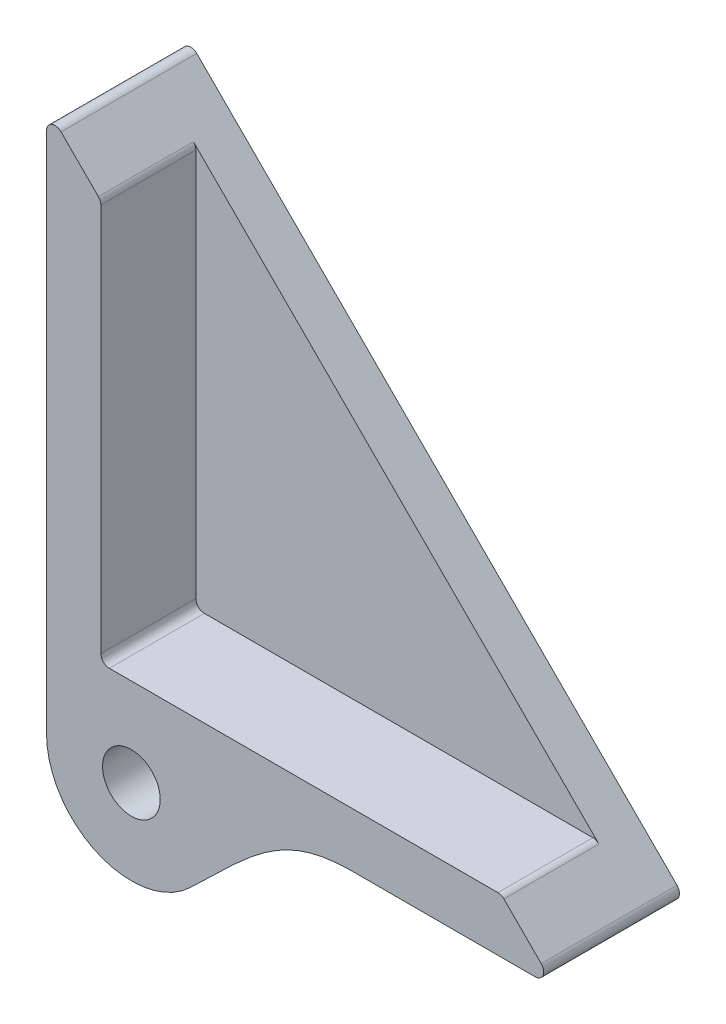
ISO-10303-21;
HEADER;
FILE_DESCRIPTION(('STEP AP214'),'2;1');
FILE_NAME('part.step','',(''),(''),'','','');
FILE_SCHEMA(('AUTOMOTIVE_DESIGN { 1 0 10303 214 1 1 1 1 }'));
ENDSEC;
DATA;
#1=APPLICATION_CONTEXT('core data for automotive mechanical design processes');
#2=APPLICATION_PROTOCOL_DEFINITION('international standard','automotive_design',2000,#1);
#3=PRODUCT_CONTEXT('',#1,'mechanical');
#4=PRODUCT('Part','Part','',(#3));
#5=PRODUCT_RELATED_PRODUCT_CATEGORY('part','',(#4));
#6=PRODUCT_DEFINITION_FORMATION('','',#4);
#7=PRODUCT_DEFINITION_CONTEXT('part definition',#1,'design');
#8=PRODUCT_DEFINITION('design','',#6,#7);
#9=PRODUCT_DEFINITION_SHAPE('','',#8);
#10=(LENGTH_UNIT() NAMED_UNIT(*) SI_UNIT(.MILLI.,.METRE.));
#11=(NAMED_UNIT(*) PLANE_ANGLE_UNIT() SI_UNIT($,.RADIAN.));
#12=(NAMED_UNIT(*) SI_UNIT($,.STERADIAN.) SOLID_ANGLE_UNIT());
#13=UNCERTAINTY_MEASURE_WITH_UNIT(LENGTH_MEASURE(1.E-05),#10,'distance_accuracy_value','');
#14=(GEOMETRIC_REPRESENTATION_CONTEXT(3) GLOBAL_UNCERTAINTY_ASSIGNED_CONTEXT((#13)) GLOBAL_UNIT_ASSIGNED_CONTEXT((#10,
#11,#12)) REPRESENTATION_CONTEXT('',''));
#15=CARTESIAN_POINT('',(0.,0.,0.));
#16=DIRECTION('',(0.,0.,1.));
#17=DIRECTION('',(1.,0.,0.));
#18=AXIS2_PLACEMENT_3D('',#15,#16,#17);
#19=CARTESIAN_POINT('',(5.,-2.,1.));
#20=DIRECTION('',(0.,0.,-1.));
#21=DIRECTION('',(-1.,0.,0.));
#22=AXIS2_PLACEMENT_3D('',#19,#20,#21);
#23=CYLINDRICAL_SURFACE('',#22,3.7);
#24=CARTESIAN_POINT('',(5.,-2.,0.));
#25=DIRECTION('',(0.,0.,-1.));
#26=DIRECTION('',(-1.,0.,0.));
#27=AXIS2_PLACEMENT_3D('',#24,#25,#26);
#28=CIRCLE('',#27,3.7);
#29=CARTESIAN_POINT('',(1.3,-2.,0.));
#30=VERTEX_POINT('',#29);
#31=EDGE_CURVE('E331',#30,#30,#28,.T.);
#32=ORIENTED_EDGE('',*,*,#31,.T.);
#33=EDGE_LOOP('',(#32));
#34=FACE_BOUND('',#33,.T.);
#35=CARTESIAN_POINT('',(5.,-2.,0.6));
#36=DIRECTION('',(0.,0.,1.));
#37=DIRECTION('',(1.,0.,0.));
#38=AXIS2_PLACEMENT_3D('',#35,#36,#37);
#39=CIRCLE('',#38,3.7);
#40=CARTESIAN_POINT('',(8.7,-2.,0.6));
#41=VERTEX_POINT('',#40);
#42=EDGE_CURVE('E11',#41,#41,#39,.F.);
#43=ORIENTED_EDGE('',*,*,#42,.F.);
#44=EDGE_LOOP('',(#43));
#45=FACE_BOUND('',#44,.T.);
#46=ADVANCED_FACE('F36',(#34,#45),#23,.F.);
#47=CARTESIAN_POINT('',(5.,-2.,8.));
#48=DIRECTION('',(0.,0.,-1.));
#49=DIRECTION('',(-1.,0.,0.));
#50=AXIS2_PLACEMENT_3D('',#47,#48,#49);
#51=CYLINDRICAL_SURFACE('',#50,1.7);
#52=CARTESIAN_POINT('',(5.,-2.,3.4));
#53=DIRECTION('',(0.,0.,1.));
#54=DIRECTION('',(1.,0.,0.));
#55=AXIS2_PLACEMENT_3D('',#52,#53,#54);
#56=CIRCLE('',#55,1.7);
#57=CARTESIAN_POINT('',(6.7,-2.,3.4));
#58=VERTEX_POINT('',#57);
#59=EDGE_CURVE('E46',#58,#58,#56,.T.);
#60=ORIENTED_EDGE('',*,*,#59,.F.);
#61=EDGE_LOOP('',(#60));
#62=FACE_BOUND('',#61,.T.);
#63=CARTESIAN_POINT('',(5.,-2.,8.));
#64=DIRECTION('',(0.,0.,1.));
#65=DIRECTION('',(1.,0.,0.));
#66=AXIS2_PLACEMENT_3D('',#63,#64,#65);
#67=CIRCLE('',#66,1.7);
#68=CARTESIAN_POINT('',(6.7,-2.,8.));
#69=VERTEX_POINT('',#68);
#70=EDGE_CURVE('E221',#69,#69,#67,.T.);
#71=ORIENTED_EDGE('',*,*,#70,.T.);
#72=EDGE_LOOP('',(#71));
#73=FACE_BOUND('',#72,.T.);
#74=ADVANCED_FACE('F215',(#62,#73),#51,.F.);
#75=CARTESIAN_POINT('',(5.,-2.,8.));
#76=DIRECTION('',(0.,0.,1.));
#77=DIRECTION('',(1.,0.,0.));
#78=AXIS2_PLACEMENT_3D('',#75,#76,#77);
#79=PLANE('',#78);
#80=DIRECTION('',(0.,-1.,0.));
#81=VECTOR('',#80,1.);
#82=CARTESIAN_POINT('',(3.2,26.8,8.));
#83=LINE('',#82,#81);
#84=CARTESIAN_POINT('',(3.2,26.5928932188135,8.));
#85=VERTEX_POINT('',#84);
#86=CARTESIAN_POINT('',(3.2,3.7,8.));
#87=VERTEX_POINT('',#86);
#88=EDGE_CURVE('E330',#85,#87,#83,.T.);
#89=ORIENTED_EDGE('',*,*,#88,.F.);
#90=CARTESIAN_POINT('',(2.7,26.5928932188135,8.));
#91=DIRECTION('',(0.,0.,1.));
#92=DIRECTION('',(1.,0.,0.));
#93=AXIS2_PLACEMENT_3D('',#90,#91,#92);
#94=CIRCLE('',#93,0.5);
#95=CARTESIAN_POINT('',(3.05355339059328,26.9464466094067,8.));
#96=VERTEX_POINT('',#95);
#97=EDGE_CURVE('E182',#85,#96,#94,.T.);
#98=ORIENTED_EDGE('',*,*,#97,.T.);
#99=DIRECTION('',(-0.707106781186548,0.707106781186547,0.));
#100=VECTOR('',#99,1.);
#101=CARTESIAN_POINT('',(0.,30.,8.));
#102=LINE('',#101,#100);
#103=CARTESIAN_POINT('',(0.853553390593273,29.1464466094067,8.));
#104=VERTEX_POINT('',#103);
#105=EDGE_CURVE('E315',#96,#104,#102,.T.);
#106=ORIENTED_EDGE('',*,*,#105,.T.);
#107=CARTESIAN_POINT('',(0.5,28.7928932188135,8.));
#108=DIRECTION('',(0.,0.,1.));
#109=DIRECTION('',(1.,0.,0.));
#110=AXIS2_PLACEMENT_3D('',#107,#108,#109);
#111=CIRCLE('',#110,0.5);
#112=CARTESIAN_POINT('',(0.,28.7928932188135,8.));
#113=VERTEX_POINT('',#112);
#114=EDGE_CURVE('E143',#104,#113,#111,.T.);
#115=ORIENTED_EDGE('',*,*,#114,.T.);
#116=DIRECTION('',(0.,-1.,0.));
#117=VECTOR('',#116,1.);
#118=CARTESIAN_POINT('',(0.,0.,8.));
#119=LINE('',#118,#117);
#120=CARTESIAN_POINT('',(0.,-2.,8.));
#121=VERTEX_POINT('',#120);
#122=EDGE_CURVE('E134',#113,#121,#119,.T.);
#123=ORIENTED_EDGE('',*,*,#122,.T.);
#124=CARTESIAN_POINT('',(5.,-2.,8.));
#125=DIRECTION('',(0.,0.,1.));
#126=DIRECTION('',(1.,0.,0.));
#127=AXIS2_PLACEMENT_3D('',#124,#125,#126);
#128=CIRCLE('',#127,5.);
#129=CARTESIAN_POINT('',(8.45751468859107,-5.61186823931563,8.));
#130=VERTEX_POINT('',#129);
#131=EDGE_CURVE('E139',#121,#130,#128,.T.);
#132=ORIENTED_EDGE('',*,*,#131,.T.);
#133=CARTESIAN_POINT('',(8.45751468859107,-5.61186823931563,8.));
#134=CARTESIAN_POINT('',(12.0907630120424,-2.13388714662437,8.));
#135=CARTESIAN_POINT('',(13.8512402383362,0.,8.));
#136=CARTESIAN_POINT('',(18.,0.,8.));
#137=B_SPLINE_CURVE_WITH_KNOTS('',3,(#133,#134,#135,#136),.UNSPECIFIED.,.F.,.F.,(4,4),(0.,1.),.UNSPECIFIED.);
#138=CARTESIAN_POINT('',(18.,0.,8.));
#139=VERTEX_POINT('',#138);
#140=EDGE_CURVE('E155',#130,#139,#137,.T.);
#141=ORIENTED_EDGE('',*,*,#140,.T.);
#142=DIRECTION('',(1.,0.,0.));
#143=VECTOR('',#142,1.);
#144=CARTESIAN_POINT('',(18.,0.,8.));
#145=LINE('',#144,#143);
#146=CARTESIAN_POINT('',(28.7928932188135,0.,8.));
#147=VERTEX_POINT('',#146);
#148=EDGE_CURVE('E238',#139,#147,#145,.T.);
#149=ORIENTED_EDGE('',*,*,#148,.T.);
#150=CARTESIAN_POINT('',(28.7928932188135,0.500000000000011,8.));
#151=DIRECTION('',(0.,0.,1.));
#152=DIRECTION('',(1.,0.,0.));
#153=AXIS2_PLACEMENT_3D('',#150,#151,#152);
#154=CIRCLE('',#153,0.5);
#155=CARTESIAN_POINT('',(29.1464466094067,0.853553390593276,8.));
#156=VERTEX_POINT('',#155);
#157=EDGE_CURVE('E178',#147,#156,#154,.T.);
#158=ORIENTED_EDGE('',*,*,#157,.T.);
#159=CARTESIAN_POINT('',(26.9464466094067,3.05355339059327,8.));
#160=VERTEX_POINT('',#159);
#161=EDGE_CURVE('E319',#156,#160,#102,.T.);
#162=ORIENTED_EDGE('',*,*,#161,.T.);
#163=CARTESIAN_POINT('',(26.5928932188135,2.7,8.));
#164=DIRECTION('',(0.,0.,1.));
#165=DIRECTION('',(1.,0.,0.));
#166=AXIS2_PLACEMENT_3D('',#163,#164,#165);
#167=CIRCLE('',#166,0.5);
#168=CARTESIAN_POINT('',(26.5928932188135,3.2,8.));
#169=VERTEX_POINT('',#168);
#170=EDGE_CURVE('E180',#160,#169,#167,.T.);
#171=ORIENTED_EDGE('',*,*,#170,.T.);
#172=DIRECTION('',(1.,0.,0.));
#173=VECTOR('',#172,1.);
#174=CARTESIAN_POINT('',(3.2,3.2,8.));
#175=LINE('',#174,#173);
#176=CARTESIAN_POINT('',(3.7,3.2,8.));
#177=VERTEX_POINT('',#176);
#178=EDGE_CURVE('E231',#177,#169,#175,.T.);
#179=ORIENTED_EDGE('',*,*,#178,.F.);
#180=CARTESIAN_POINT('',(3.7,3.7,8.));
#181=DIRECTION('',(0.,0.,1.));
#182=DIRECTION('',(1.,0.,0.));
#183=AXIS2_PLACEMENT_3D('',#180,#181,#182);
#184=CIRCLE('',#183,0.5);
#185=EDGE_CURVE('E201',#177,#87,#184,.F.);
#186=ORIENTED_EDGE('',*,*,#185,.T.);
#187=EDGE_LOOP('',(#89,#98,#106,#115,#123,#132,#141,#149,#158,#162,#171,#179,#186));
#188=FACE_BOUND('',#187,.T.);
#189=ORIENTED_EDGE('',*,*,#70,.F.);
#190=EDGE_LOOP('',(#189));
#191=FACE_BOUND('',#190,.T.);
#192=ADVANCED_FACE('F137',(#188,#191),#79,.T.);
#193=CARTESIAN_POINT('',(5.,-2.,0.));
#194=DIRECTION('',(0.,0.,1.));
#195=DIRECTION('',(1.,0.,0.));
#196=AXIS2_PLACEMENT_3D('',#193,#194,#195);
#197=PLANE('',#196);
#198=ORIENTED_EDGE('',*,*,#31,.F.);
#199=EDGE_LOOP('',(#198));
#200=FACE_BOUND('',#199,.T.);
#201=DIRECTION('',(-0.707106781186548,0.707106781186547,0.));
#202=VECTOR('',#201,1.);
#203=CARTESIAN_POINT('',(0.,30.,0.));
#204=LINE('',#203,#202);
#205=CARTESIAN_POINT('',(29.1464466094067,0.853553390593276,0.));
#206=VERTEX_POINT('',#205);
#207=CARTESIAN_POINT('',(0.853553390593273,29.1464466094067,0.));
#208=VERTEX_POINT('',#207);
#209=EDGE_CURVE('E479',#206,#208,#204,.T.);
#210=ORIENTED_EDGE('',*,*,#209,.F.);
#211=CARTESIAN_POINT('',(28.7928932188135,0.500000000000011,0.));
#212=DIRECTION('',(0.,0.,1.));
#213=DIRECTION('',(1.,0.,0.));
#214=AXIS2_PLACEMENT_3D('',#211,#212,#213);
#215=CIRCLE('',#214,0.5);
#216=CARTESIAN_POINT('',(28.7928932188135,0.,0.));
#217=VERTEX_POINT('',#216);
#218=EDGE_CURVE('E53',#206,#217,#215,.F.);
#219=ORIENTED_EDGE('',*,*,#218,.T.);
#220=DIRECTION('',(1.,0.,0.));
#221=VECTOR('',#220,1.);
#222=CARTESIAN_POINT('',(18.,0.,0.));
#223=LINE('',#222,#221);
#224=CARTESIAN_POINT('',(18.,0.,0.));
#225=VERTEX_POINT('',#224);
#226=EDGE_CURVE('E480',#225,#217,#223,.T.);
#227=ORIENTED_EDGE('',*,*,#226,.F.);
#228=CARTESIAN_POINT('',(8.45751468859107,-5.61186823931563,0.));
#229=CARTESIAN_POINT('',(12.0907630120424,-2.13388714662437,0.));
#230=CARTESIAN_POINT('',(13.8512402383362,0.,0.));
#231=CARTESIAN_POINT('',(18.,0.,0.));
#232=B_SPLINE_CURVE_WITH_KNOTS('',3,(#228,#229,#230,#231),.UNSPECIFIED.,.F.,.F.,(4,4),(0.,1.),.UNSPECIFIED.);
#233=CARTESIAN_POINT('',(8.45751468859107,-5.61186823931563,0.));
#234=VERTEX_POINT('',#233);
#235=EDGE_CURVE('E225',#234,#225,#232,.T.);
#236=ORIENTED_EDGE('',*,*,#235,.F.);
#237=CARTESIAN_POINT('',(5.,-2.,0.));
#238=DIRECTION('',(0.,0.,1.));
#239=DIRECTION('',(1.,0.,0.));
#240=AXIS2_PLACEMENT_3D('',#237,#238,#239);
#241=CIRCLE('',#240,5.);
#242=CARTESIAN_POINT('',(0.,-2.,0.));
#243=VERTEX_POINT('',#242);
#244=EDGE_CURVE('E222',#243,#234,#241,.T.);
#245=ORIENTED_EDGE('',*,*,#244,.F.);
#246=DIRECTION('',(0.,-1.,0.));
#247=VECTOR('',#246,1.);
#248=CARTESIAN_POINT('',(0.,0.,0.));
#249=LINE('',#248,#247);
#250=CARTESIAN_POINT('',(0.,28.7928932188135,0.));
#251=VERTEX_POINT('',#250);
#252=EDGE_CURVE('E146',#251,#243,#249,.T.);
#253=ORIENTED_EDGE('',*,*,#252,.F.);
#254=CARTESIAN_POINT('',(0.5,28.7928932188135,0.));
#255=DIRECTION('',(0.,0.,1.));
#256=DIRECTION('',(1.,0.,0.));
#257=AXIS2_PLACEMENT_3D('',#254,#255,#256);
#258=CIRCLE('',#257,0.5);
#259=EDGE_CURVE('E61',#251,#208,#258,.F.);
#260=ORIENTED_EDGE('',*,*,#259,.T.);
#261=EDGE_LOOP('',(#210,#219,#227,#236,#245,#253,#260));
#262=FACE_BOUND('',#261,.T.);
#263=ADVANCED_FACE('F253',(#200,#262),#197,.F.);
#264=CARTESIAN_POINT('',(5.,-2.,8.));
#265=DIRECTION('',(0.,0.,-1.));
#266=DIRECTION('',(-1.,0.,0.));
#267=AXIS2_PLACEMENT_3D('',#264,#265,#266);
#268=CYLINDRICAL_SURFACE('',#267,5.);
#269=ORIENTED_EDGE('',*,*,#244,.T.);
#270=DIRECTION('',(0.,0.,-1.));
#271=VECTOR('',#270,1.);
#272=CARTESIAN_POINT('',(8.45751468859107,-5.61186823931563,8.));
#273=LINE('',#272,#271);
#274=EDGE_CURVE('E153',#130,#234,#273,.T.);
#275=ORIENTED_EDGE('',*,*,#274,.F.);
#276=ORIENTED_EDGE('',*,*,#131,.F.);
#277=DIRECTION('',(0.,0.,-1.));
#278=VECTOR('',#277,1.);
#279=CARTESIAN_POINT('',(0.,-2.,8.));
#280=LINE('',#279,#278);
#281=EDGE_CURVE('E151',#121,#243,#280,.T.);
#282=ORIENTED_EDGE('',*,*,#281,.T.);
#283=EDGE_LOOP('',(#269,#275,#276,#282));
#284=FACE_BOUND('',#283,.T.);
#285=ADVANCED_FACE('F150',(#284),#268,.T.);
#286=DIRECTION('',(0.,0.,-1.));
#287=VECTOR('',#286,1.);
#288=SURFACE_OF_LINEAR_EXTRUSION('',#137,#287);
#289=ORIENTED_EDGE('',*,*,#235,.T.);
#290=DIRECTION('',(0.,0.,-1.));
#291=VECTOR('',#290,1.);
#292=CARTESIAN_POINT('',(18.,0.,8.));
#293=LINE('',#292,#291);
#294=EDGE_CURVE('E164',#139,#225,#293,.T.);
#295=ORIENTED_EDGE('',*,*,#294,.F.);
#296=ORIENTED_EDGE('',*,*,#140,.F.);
#297=ORIENTED_EDGE('',*,*,#274,.T.);
#298=EDGE_LOOP('',(#289,#295,#296,#297));
#299=FACE_BOUND('',#298,.T.);
#300=ADVANCED_FACE('F244',(#299),#288,.F.);
#301=CARTESIAN_POINT('',(18.,0.,8.));
#302=DIRECTION('',(0.,1.,0.));
#303=DIRECTION('',(-1.,0.,0.));
#304=AXIS2_PLACEMENT_3D('',#301,#302,#303);
#305=PLANE('',#304);
#306=ORIENTED_EDGE('',*,*,#226,.T.);
#307=DIRECTION('',(0.,0.,-1.));
#308=VECTOR('',#307,1.);
#309=CARTESIAN_POINT('',(28.7928932188135,0.,8.));
#310=LINE('',#309,#308);
#311=EDGE_CURVE('E197',#217,#147,#310,.F.);
#312=ORIENTED_EDGE('',*,*,#311,.T.);
#313=ORIENTED_EDGE('',*,*,#148,.F.);
#314=ORIENTED_EDGE('',*,*,#294,.T.);
#315=EDGE_LOOP('',(#306,#312,#313,#314));
#316=FACE_BOUND('',#315,.T.);
#317=ADVANCED_FACE('F248',(#316),#305,.F.);
#318=CARTESIAN_POINT('',(0.,30.,8.));
#319=DIRECTION('',(-0.707106781186547,-0.707106781186548,0.));
#320=DIRECTION('',(0.707106781186548,-0.707106781186547,0.));
#321=AXIS2_PLACEMENT_3D('',#318,#319,#320);
#322=PLANE('',#321);
#323=ORIENTED_EDGE('',*,*,#105,.F.);
#324=DIRECTION('',(0.,0.,1.));
#325=VECTOR('',#324,1.);
#326=CARTESIAN_POINT('',(3.05355339059328,26.9464466094067,8.));
#327=LINE('',#326,#325);
#328=CARTESIAN_POINT('',(3.05355339059328,26.9464466094067,2.4));
#329=VERTEX_POINT('',#328);
#330=EDGE_CURVE('E192',#96,#329,#327,.F.);
#331=ORIENTED_EDGE('',*,*,#330,.T.);
#332=DIRECTION('',(-0.707106781186547,0.707106781186547,0.));
#333=VECTOR('',#332,1.);
#334=CARTESIAN_POINT('',(26.8,3.2,2.4));
#335=LINE('',#334,#333);
#336=CARTESIAN_POINT('',(26.9464466094067,3.05355339059328,2.4));
#337=VERTEX_POINT('',#336);
#338=EDGE_CURVE('E324',#337,#329,#335,.T.);
#339=ORIENTED_EDGE('',*,*,#338,.F.);
#340=DIRECTION('',(0.,0.,1.));
#341=VECTOR('',#340,1.);
#342=CARTESIAN_POINT('',(26.9464466094067,3.05355339059327,8.));
#343=LINE('',#342,#341);
#344=EDGE_CURVE('E189',#337,#160,#343,.T.);
#345=ORIENTED_EDGE('',*,*,#344,.T.);
#346=ORIENTED_EDGE('',*,*,#161,.F.);
#347=DIRECTION('',(0.,0.,-1.));
#348=VECTOR('',#347,1.);
#349=CARTESIAN_POINT('',(29.1464466094067,0.853553390593276,8.));
#350=LINE('',#349,#348);
#351=EDGE_CURVE('E186',#156,#206,#350,.T.);
#352=ORIENTED_EDGE('',*,*,#351,.T.);
#353=ORIENTED_EDGE('',*,*,#209,.T.);
#354=DIRECTION('',(0.,0.,-1.));
#355=VECTOR('',#354,1.);
#356=CARTESIAN_POINT('',(0.853553390593273,29.1464466094067,8.));
#357=LINE('',#356,#355);
#358=EDGE_CURVE('E184',#208,#104,#357,.F.);
#359=ORIENTED_EDGE('',*,*,#358,.T.);
#360=EDGE_LOOP('',(#323,#331,#339,#345,#346,#352,#353,#359));
#361=FACE_BOUND('',#360,.T.);
#362=ADVANCED_FACE('F307',(#361),#322,.F.);
#363=CARTESIAN_POINT('',(0.,0.,8.));
#364=DIRECTION('',(1.,0.,0.));
#365=DIRECTION('',(0.,0.,-1.));
#366=AXIS2_PLACEMENT_3D('',#363,#364,#365);
#367=PLANE('',#366);
#368=ORIENTED_EDGE('',*,*,#122,.F.);
#369=DIRECTION('',(0.,0.,-1.));
#370=VECTOR('',#369,1.);
#371=CARTESIAN_POINT('',(0.,28.7928932188135,8.));
#372=LINE('',#371,#370);
#373=EDGE_CURVE('E199',#113,#251,#372,.T.);
#374=ORIENTED_EDGE('',*,*,#373,.T.);
#375=ORIENTED_EDGE('',*,*,#252,.T.);
#376=ORIENTED_EDGE('',*,*,#281,.F.);
#377=EDGE_LOOP('',(#368,#374,#375,#376));
#378=FACE_BOUND('',#377,.T.);
#379=ADVANCED_FACE('F157',(#378),#367,.F.);
#380=CARTESIAN_POINT('',(3.2,3.2,2.4));
#381=DIRECTION('',(0.,-1.,0.));
#382=DIRECTION('',(1.,0.,0.));
#383=AXIS2_PLACEMENT_3D('',#380,#381,#382);
#384=PLANE('',#383);
#385=DIRECTION('',(1.,0.,0.));
#386=VECTOR('',#385,1.);
#387=CARTESIAN_POINT('',(3.2,3.2,2.4));
#388=LINE('',#387,#386);
#389=CARTESIAN_POINT('',(3.7,3.2,2.4));
#390=VERTEX_POINT('',#389);
#391=CARTESIAN_POINT('',(26.5928932188135,3.2,2.4));
#392=VERTEX_POINT('',#391);
#393=EDGE_CURVE('E223',#390,#392,#388,.T.);
#394=ORIENTED_EDGE('',*,*,#393,.F.);
#395=DIRECTION('',(0.,0.,1.));
#396=VECTOR('',#395,1.);
#397=CARTESIAN_POINT('',(3.7,3.2,8.));
#398=LINE('',#397,#396);
#399=EDGE_CURVE('E162',#390,#177,#398,.T.);
#400=ORIENTED_EDGE('',*,*,#399,.T.);
#401=ORIENTED_EDGE('',*,*,#178,.T.);
#402=DIRECTION('',(0.,0.,1.));
#403=VECTOR('',#402,1.);
#404=CARTESIAN_POINT('',(26.5928932188135,3.2,2.4));
#405=LINE('',#404,#403);
#406=EDGE_CURVE('E160',#169,#392,#405,.F.);
#407=ORIENTED_EDGE('',*,*,#406,.T.);
#408=EDGE_LOOP('',(#394,#400,#401,#407));
#409=FACE_BOUND('',#408,.T.);
#410=ADVANCED_FACE('F294',(#409),#384,.F.);
#411=CARTESIAN_POINT('',(3.2,26.8,2.4));
#412=DIRECTION('',(-1.,0.,0.));
#413=DIRECTION('',(0.,-1.,0.));
#414=AXIS2_PLACEMENT_3D('',#411,#412,#413);
#415=PLANE('',#414);
#416=ORIENTED_EDGE('',*,*,#88,.T.);
#417=DIRECTION('',(0.,0.,1.));
#418=VECTOR('',#417,1.);
#419=CARTESIAN_POINT('',(3.2,3.7,2.4));
#420=LINE('',#419,#418);
#421=CARTESIAN_POINT('',(3.2,3.7,2.4));
#422=VERTEX_POINT('',#421);
#423=EDGE_CURVE('E173',#87,#422,#420,.F.);
#424=ORIENTED_EDGE('',*,*,#423,.T.);
#425=DIRECTION('',(0.,-1.,0.));
#426=VECTOR('',#425,1.);
#427=CARTESIAN_POINT('',(3.2,26.8,2.4));
#428=LINE('',#427,#426);
#429=CARTESIAN_POINT('',(3.2,26.5928932188135,2.4));
#430=VERTEX_POINT('',#429);
#431=EDGE_CURVE('E228',#430,#422,#428,.T.);
#432=ORIENTED_EDGE('',*,*,#431,.F.);
#433=DIRECTION('',(0.,0.,1.));
#434=VECTOR('',#433,1.);
#435=CARTESIAN_POINT('',(3.2,26.5928932188135,2.4));
#436=LINE('',#435,#434);
#437=EDGE_CURVE('E170',#430,#85,#436,.T.);
#438=ORIENTED_EDGE('',*,*,#437,.T.);
#439=EDGE_LOOP('',(#416,#424,#432,#438));
#440=FACE_BOUND('',#439,.T.);
#441=ADVANCED_FACE('F292',(#440),#415,.F.);
#442=CARTESIAN_POINT('',(0.,0.,2.4));
#443=DIRECTION('',(0.,0.,1.));
#444=DIRECTION('',(1.,0.,0.));
#445=AXIS2_PLACEMENT_3D('',#442,#443,#444);
#446=PLANE('',#445);
#447=ORIENTED_EDGE('',*,*,#431,.T.);
#448=CARTESIAN_POINT('',(3.7,3.7,2.4));
#449=DIRECTION('',(0.,0.,1.));
#450=DIRECTION('',(1.,0.,0.));
#451=AXIS2_PLACEMENT_3D('',#448,#449,#450);
#452=CIRCLE('',#451,0.5);
#453=EDGE_CURVE('E175',#422,#390,#452,.T.);
#454=ORIENTED_EDGE('',*,*,#453,.T.);
#455=ORIENTED_EDGE('',*,*,#393,.T.);
#456=CARTESIAN_POINT('',(26.5928932188135,2.7,2.4));
#457=DIRECTION('',(0.,0.,1.));
#458=DIRECTION('',(1.,0.,0.));
#459=AXIS2_PLACEMENT_3D('',#456,#457,#458);
#460=CIRCLE('',#459,0.5);
#461=EDGE_CURVE('E205',#392,#337,#460,.F.);
#462=ORIENTED_EDGE('',*,*,#461,.T.);
#463=ORIENTED_EDGE('',*,*,#338,.T.);
#464=CARTESIAN_POINT('',(2.7,26.5928932188135,2.4));
#465=DIRECTION('',(0.,0.,1.));
#466=DIRECTION('',(1.,0.,0.));
#467=AXIS2_PLACEMENT_3D('',#464,#465,#466);
#468=CIRCLE('',#467,0.5);
#469=EDGE_CURVE('E203',#329,#430,#468,.F.);
#470=ORIENTED_EDGE('',*,*,#469,.T.);
#471=EDGE_LOOP('',(#447,#454,#455,#462,#463,#470));
#472=FACE_BOUND('',#471,.T.);
#473=ADVANCED_FACE('F258',(#472),#446,.T.);
#474=CARTESIAN_POINT('',(3.7,3.7,2.4));
#475=DIRECTION('',(0.,0.,-1.));
#476=DIRECTION('',(-1.,0.,0.));
#477=AXIS2_PLACEMENT_3D('',#474,#475,#476);
#478=CYLINDRICAL_SURFACE('',#477,0.5);
#479=ORIENTED_EDGE('',*,*,#453,.F.);
#480=ORIENTED_EDGE('',*,*,#423,.F.);
#481=ORIENTED_EDGE('',*,*,#185,.F.);
#482=ORIENTED_EDGE('',*,*,#399,.F.);
#483=EDGE_LOOP('',(#479,#480,#481,#482));
#484=FACE_BOUND('',#483,.T.);
#485=ADVANCED_FACE('F254',(#484),#478,.F.);
#486=CARTESIAN_POINT('',(2.7,26.5928932188135,2.4));
#487=DIRECTION('',(0.,0.,1.));
#488=DIRECTION('',(1.,0.,0.));
#489=AXIS2_PLACEMENT_3D('',#486,#487,#488);
#490=CYLINDRICAL_SURFACE('',#489,0.5);
#491=ORIENTED_EDGE('',*,*,#469,.F.);
#492=ORIENTED_EDGE('',*,*,#330,.F.);
#493=ORIENTED_EDGE('',*,*,#97,.F.);
#494=ORIENTED_EDGE('',*,*,#437,.F.);
#495=EDGE_LOOP('',(#491,#492,#493,#494));
#496=FACE_BOUND('',#495,.T.);
#497=ADVANCED_FACE('F257',(#496),#490,.T.);
#498=CARTESIAN_POINT('',(26.5928932188135,2.7,8.));
#499=DIRECTION('',(0.,0.,1.));
#500=DIRECTION('',(1.,0.,0.));
#501=AXIS2_PLACEMENT_3D('',#498,#499,#500);
#502=CYLINDRICAL_SURFACE('',#501,0.5);
#503=ORIENTED_EDGE('',*,*,#461,.F.);
#504=ORIENTED_EDGE('',*,*,#406,.F.);
#505=ORIENTED_EDGE('',*,*,#170,.F.);
#506=ORIENTED_EDGE('',*,*,#344,.F.);
#507=EDGE_LOOP('',(#503,#504,#505,#506));
#508=FACE_BOUND('',#507,.T.);
#509=ADVANCED_FACE('F262',(#508),#502,.T.);
#510=CARTESIAN_POINT('',(28.7928932188135,0.500000000000011,8.));
#511=DIRECTION('',(0.,0.,-1.));
#512=DIRECTION('',(-1.,0.,0.));
#513=AXIS2_PLACEMENT_3D('',#510,#511,#512);
#514=CYLINDRICAL_SURFACE('',#513,0.5);
#515=ORIENTED_EDGE('',*,*,#157,.F.);
#516=ORIENTED_EDGE('',*,*,#311,.F.);
#517=ORIENTED_EDGE('',*,*,#218,.F.);
#518=ORIENTED_EDGE('',*,*,#351,.F.);
#519=EDGE_LOOP('',(#515,#516,#517,#518));
#520=FACE_BOUND('',#519,.T.);
#521=ADVANCED_FACE('F266',(#520),#514,.T.);
#522=CARTESIAN_POINT('',(0.5,28.7928932188135,8.));
#523=DIRECTION('',(0.,0.,-1.));
#524=DIRECTION('',(-1.,0.,0.));
#525=AXIS2_PLACEMENT_3D('',#522,#523,#524);
#526=CYLINDRICAL_SURFACE('',#525,0.5);
#527=ORIENTED_EDGE('',*,*,#114,.F.);
#528=ORIENTED_EDGE('',*,*,#358,.F.);
#529=ORIENTED_EDGE('',*,*,#259,.F.);
#530=ORIENTED_EDGE('',*,*,#373,.F.);
#531=EDGE_LOOP('',(#527,#528,#529,#530));
#532=FACE_BOUND('',#531,.T.);
#533=ADVANCED_FACE('F269',(#532),#526,.T.);
#534=CARTESIAN_POINT('',(5.,-2.,3.4));
#535=DIRECTION('',(0.,0.,1.));
#536=DIRECTION('',(1.,0.,0.));
#537=AXIS2_PLACEMENT_3D('',#534,#535,#536);
#538=PLANE('',#537);
#539=ORIENTED_EDGE('',*,*,#59,.T.);
#540=EDGE_LOOP('',(#539));
#541=FACE_BOUND('',#540,.T.);
#542=ADVANCED_FACE('F213',(#541),#538,.T.);
#543=CARTESIAN_POINT('',(5.,-2.,0.6));
#544=DIRECTION('',(0.,0.,1.));
#545=DIRECTION('',(1.,0.,0.));
#546=AXIS2_PLACEMENT_3D('',#543,#544,#545);
#547=PLANE('',#546);
#548=ORIENTED_EDGE('',*,*,#42,.T.);
#549=EDGE_LOOP('',(#548));
#550=FACE_BOUND('',#549,.T.);
#551=ADVANCED_FACE('F276',(#550),#547,.F.);
#552=CLOSED_SHELL('',(#46,#74,#192,#263,#285,#300,#317,#362,#379,#410,#441,#473,#485,#497,#509,
#521,#533,#542,#551));
#553=CARTESIAN_POINT('',(5.,-2.,3.));
#554=DIRECTION('',(0.,0.,1.));
#555=DIRECTION('',(1.,0.,0.));
#556=AXIS2_PLACEMENT_3D('',#553,#554,#555);
#557=PLANE('',#556);
#558=CARTESIAN_POINT('',(5.,-2.,3.));
#559=DIRECTION('',(0.,0.,-1.));
#560=DIRECTION('',(-1.,0.,0.));
#561=AXIS2_PLACEMENT_3D('',#558,#559,#560);
#562=CIRCLE('',#561,1.7);
#563=CARTESIAN_POINT('',(3.3,-2.,3.));
#564=VERTEX_POINT('',#563);
#565=EDGE_CURVE('E208',#564,#564,#562,.T.);
#566=ORIENTED_EDGE('',*,*,#565,.T.);
#567=EDGE_LOOP('',(#566));
#568=FACE_BOUND('',#567,.T.);
#569=ADVANCED_FACE('F289',(#568),#557,.F.);
#570=CARTESIAN_POINT('',(5.,-2.,3.));
#571=DIRECTION('',(0.,0.,-1.));
#572=DIRECTION('',(-1.,0.,0.));
#573=AXIS2_PLACEMENT_3D('',#570,#571,#572);
#574=CONICAL_SURFACE('',#573,1.7,0.785398163397449);
#575=CARTESIAN_POINT('',(5.,-2.,1.));
#576=DIRECTION('',(0.,0.,1.));
#577=DIRECTION('',(1.,0.,0.));
#578=AXIS2_PLACEMENT_3D('',#575,#576,#577);
#579=CIRCLE('',#578,3.7);
#580=CARTESIAN_POINT('',(8.7,-2.,1.));
#581=VERTEX_POINT('',#580);
#582=EDGE_CURVE('E333',#581,#581,#579,.T.);
#583=ORIENTED_EDGE('',*,*,#582,.F.);
#584=EDGE_LOOP('',(#583));
#585=FACE_BOUND('',#584,.T.);
#586=ORIENTED_EDGE('',*,*,#565,.F.);
#587=EDGE_LOOP('',(#586));
#588=FACE_BOUND('',#587,.T.);
#589=ADVANCED_FACE('F39',(#585,#588),#574,.F.);
#590=CARTESIAN_POINT('',(5.,-2.,1.));
#591=DIRECTION('',(0.,0.,1.));
#592=DIRECTION('',(1.,0.,0.));
#593=AXIS2_PLACEMENT_3D('',#590,#591,#592);
#594=PLANE('',#593);
#595=ORIENTED_EDGE('',*,*,#582,.T.);
#596=EDGE_LOOP('',(#595));
#597=FACE_BOUND('',#596,.T.);
#598=ADVANCED_FACE('F339',(#597),#594,.T.);
#599=CLOSED_SHELL('',(#569,#589,#598));
#600=ORIENTED_CLOSED_SHELL('',*,#599,.T.);
#601=BREP_WITH_VOIDS('B2',#552,(#600));
#602=ADVANCED_BREP_SHAPE_REPRESENTATION('',(#18,#601),#14);
#603=SHAPE_DEFINITION_REPRESENTATION(#9,#602);
ENDSEC;
END-ISO-10303-21;
